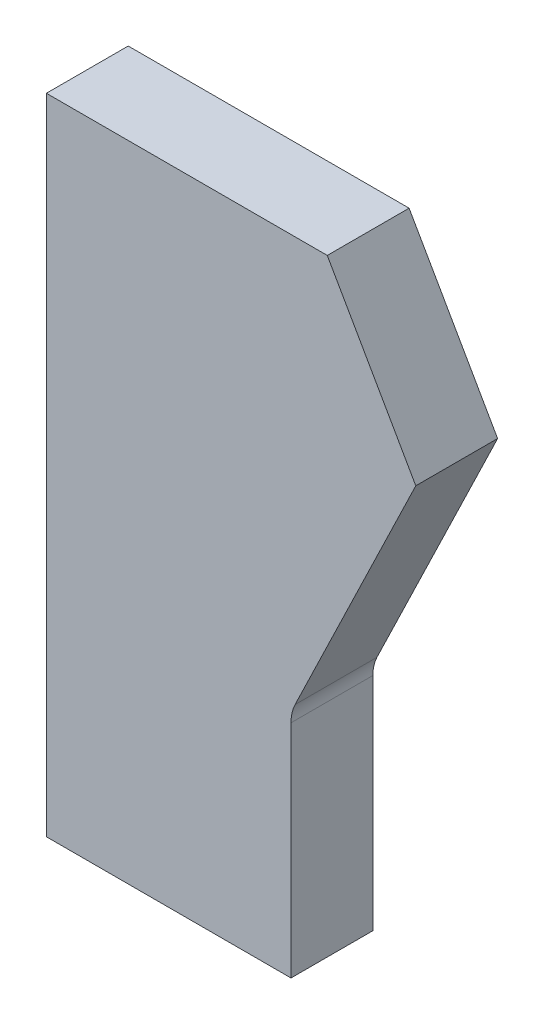
ISO-10303-21;
HEADER;
FILE_DESCRIPTION(('STEP AP214'),'2;1');
FILE_NAME('part.step','',(''),(''),'','','');
FILE_SCHEMA(('AUTOMOTIVE_DESIGN { 1 0 10303 214 1 1 1 1 }'));
ENDSEC;
DATA;
#1=APPLICATION_CONTEXT('core data for automotive mechanical design processes');
#2=APPLICATION_PROTOCOL_DEFINITION('international standard','automotive_design',2000,#1);
#3=PRODUCT_CONTEXT('',#1,'mechanical');
#4=PRODUCT('Part','Part','',(#3));
#5=PRODUCT_RELATED_PRODUCT_CATEGORY('part','',(#4));
#6=PRODUCT_DEFINITION_FORMATION('','',#4);
#7=PRODUCT_DEFINITION_CONTEXT('part definition',#1,'design');
#8=PRODUCT_DEFINITION('design','',#6,#7);
#9=PRODUCT_DEFINITION_SHAPE('','',#8);
#10=(LENGTH_UNIT() NAMED_UNIT(*) SI_UNIT(.MILLI.,.METRE.));
#11=(NAMED_UNIT(*) PLANE_ANGLE_UNIT() SI_UNIT($,.RADIAN.));
#12=(NAMED_UNIT(*) SI_UNIT($,.STERADIAN.) SOLID_ANGLE_UNIT());
#13=UNCERTAINTY_MEASURE_WITH_UNIT(LENGTH_MEASURE(1.E-05),#10,'distance_accuracy_value','');
#14=(GEOMETRIC_REPRESENTATION_CONTEXT(3) GLOBAL_UNCERTAINTY_ASSIGNED_CONTEXT((#13)) GLOBAL_UNIT_ASSIGNED_CONTEXT((#10,
#11,#12)) REPRESENTATION_CONTEXT('',''));
#15=CARTESIAN_POINT('',(0.,0.,0.));
#16=DIRECTION('',(0.,0.,1.));
#17=DIRECTION('',(1.,0.,0.));
#18=AXIS2_PLACEMENT_3D('',#15,#16,#17);
#19=CARTESIAN_POINT('',(0.,199.877455637007,-25.4));
#20=DIRECTION('',(-1.,0.,0.));
#21=DIRECTION('',(0.,0.,1.));
#22=AXIS2_PLACEMENT_3D('',#19,#20,#21);
#23=PLANE('',#22);
#24=DIRECTION('',(0.,-1.,0.));
#25=VECTOR('',#24,1.);
#26=CARTESIAN_POINT('',(0.,199.877455637007,0.));
#27=LINE('',#26,#25);
#28=CARTESIAN_POINT('',(0.,199.877455637007,0.));
#29=VERTEX_POINT('',#28);
#30=CARTESIAN_POINT('',(0.,0.,0.));
#31=VERTEX_POINT('',#30);
#32=EDGE_CURVE('E122',#29,#31,#27,.T.);
#33=ORIENTED_EDGE('',*,*,#32,.F.);
#34=DIRECTION('',(0.,0.,1.));
#35=VECTOR('',#34,1.);
#36=CARTESIAN_POINT('',(0.,199.877455637007,-25.4));
#37=LINE('',#36,#35);
#38=CARTESIAN_POINT('',(0.,199.877455637007,-25.4));
#39=VERTEX_POINT('',#38);
#40=EDGE_CURVE('E11',#39,#29,#37,.T.);
#41=ORIENTED_EDGE('',*,*,#40,.F.);
#42=DIRECTION('',(0.,-1.,0.));
#43=VECTOR('',#42,1.);
#44=CARTESIAN_POINT('',(0.,199.877455637007,-25.4));
#45=LINE('',#44,#43);
#46=CARTESIAN_POINT('',(0.,0.,-25.4));
#47=VERTEX_POINT('',#46);
#48=EDGE_CURVE('E139',#39,#47,#45,.T.);
#49=ORIENTED_EDGE('',*,*,#48,.T.);
#50=DIRECTION('',(0.,0.,1.));
#51=VECTOR('',#50,1.);
#52=CARTESIAN_POINT('',(0.,0.,-25.4));
#53=LINE('',#52,#51);
#54=EDGE_CURVE('E34',#47,#31,#53,.T.);
#55=ORIENTED_EDGE('',*,*,#54,.T.);
#56=EDGE_LOOP('',(#33,#41,#49,#55));
#57=FACE_BOUND('',#56,.T.);
#58=ADVANCED_FACE('F31',(#57),#23,.T.);
#59=CARTESIAN_POINT('',(87.1895842060916,199.877455637007,-25.4));
#60=DIRECTION('',(0.,1.,0.));
#61=DIRECTION('',(0.,0.,1.));
#62=AXIS2_PLACEMENT_3D('',#59,#60,#61);
#63=PLANE('',#62);
#64=DIRECTION('',(-1.,0.,0.));
#65=VECTOR('',#64,1.);
#66=CARTESIAN_POINT('',(87.1895842060916,199.877455637007,0.));
#67=LINE('',#66,#65);
#68=CARTESIAN_POINT('',(87.1895842060916,199.877455637007,0.));
#69=VERTEX_POINT('',#68);
#70=EDGE_CURVE('E137',#69,#29,#67,.T.);
#71=ORIENTED_EDGE('',*,*,#70,.F.);
#72=DIRECTION('',(0.,0.,1.));
#73=VECTOR('',#72,1.);
#74=CARTESIAN_POINT('',(87.1895842060916,199.877455637007,-25.4));
#75=LINE('',#74,#73);
#76=CARTESIAN_POINT('',(87.1895842060916,199.877455637007,-25.4));
#77=VERTEX_POINT('',#76);
#78=EDGE_CURVE('E40',#77,#69,#75,.T.);
#79=ORIENTED_EDGE('',*,*,#78,.F.);
#80=DIRECTION('',(-1.,0.,0.));
#81=VECTOR('',#80,1.);
#82=CARTESIAN_POINT('',(87.1895842060916,199.877455637007,-25.4));
#83=LINE('',#82,#81);
#84=EDGE_CURVE('E112',#77,#39,#83,.T.);
#85=ORIENTED_EDGE('',*,*,#84,.T.);
#86=ORIENTED_EDGE('',*,*,#40,.T.);
#87=EDGE_LOOP('',(#71,#79,#85,#86));
#88=FACE_BOUND('',#87,.T.);
#89=ADVANCED_FACE('F149',(#88),#63,.T.);
#90=CARTESIAN_POINT('',(114.663486185974,151.685529213279,-25.4));
#91=DIRECTION('',(0.86874233800086,0.495264323533201,0.));
#92=DIRECTION('',(-0.495264323533201,0.86874233800086,0.));
#93=AXIS2_PLACEMENT_3D('',#90,#91,#92);
#94=PLANE('',#93);
#95=DIRECTION('',(-0.495264323533201,0.86874233800086,0.));
#96=VECTOR('',#95,1.);
#97=CARTESIAN_POINT('',(114.663486185974,151.685529213279,0.));
#98=LINE('',#97,#96);
#99=CARTESIAN_POINT('',(114.663486185974,151.685529213279,0.));
#100=VERTEX_POINT('',#99);
#101=EDGE_CURVE('E99',#100,#69,#98,.T.);
#102=ORIENTED_EDGE('',*,*,#101,.F.);
#103=DIRECTION('',(0.,0.,1.));
#104=VECTOR('',#103,1.);
#105=CARTESIAN_POINT('',(114.663486185974,151.685529213279,-25.4));
#106=LINE('',#105,#104);
#107=CARTESIAN_POINT('',(114.663486185974,151.685529213279,-25.4));
#108=VERTEX_POINT('',#107);
#109=EDGE_CURVE('E94',#108,#100,#106,.T.);
#110=ORIENTED_EDGE('',*,*,#109,.F.);
#111=DIRECTION('',(-0.495264323533201,0.86874233800086,0.));
#112=VECTOR('',#111,1.);
#113=CARTESIAN_POINT('',(114.663486185974,151.685529213279,-25.4));
#114=LINE('',#113,#112);
#115=EDGE_CURVE('E97',#108,#77,#114,.T.);
#116=ORIENTED_EDGE('',*,*,#115,.T.);
#117=ORIENTED_EDGE('',*,*,#78,.T.);
#118=EDGE_LOOP('',(#102,#110,#116,#117));
#119=FACE_BOUND('',#118,.T.);
#120=ADVANCED_FACE('F96',(#119),#94,.T.);
#121=CARTESIAN_POINT('',(77.1945177207634,74.1334782038901,-25.4));
#122=DIRECTION('',(0.900415007238886,-0.435031969789574,0.));
#123=DIRECTION('',(0.435031969789575,0.900415007238886,0.));
#124=AXIS2_PLACEMENT_3D('',#121,#122,#123);
#125=PLANE('',#124);
#126=DIRECTION('',(0.435031969789574,0.900415007238886,0.));
#127=VECTOR('',#126,1.);
#128=CARTESIAN_POINT('',(77.1945177207634,74.1334782038901,0.));
#129=LINE('',#128,#127);
#130=CARTESIAN_POINT('',(77.1945177207634,74.1334782038901,0.));
#131=VERTEX_POINT('',#130);
#132=EDGE_CURVE('E134',#131,#100,#129,.T.);
#133=ORIENTED_EDGE('',*,*,#132,.F.);
#134=DIRECTION('',(0.,0.,1.));
#135=VECTOR('',#134,1.);
#136=CARTESIAN_POINT('',(77.1945177207634,74.1334782038901,-25.4));
#137=LINE('',#136,#135);
#138=CARTESIAN_POINT('',(77.1945177207634,74.1334782038901,-25.4));
#139=VERTEX_POINT('',#138);
#140=EDGE_CURVE('E104',#139,#131,#137,.T.);
#141=ORIENTED_EDGE('',*,*,#140,.F.);
#142=DIRECTION('',(0.435031969789574,0.900415007238886,0.));
#143=VECTOR('',#142,1.);
#144=CARTESIAN_POINT('',(77.1945177207634,74.1334782038901,-25.4));
#145=LINE('',#144,#143);
#146=EDGE_CURVE('E110',#139,#108,#145,.T.);
#147=ORIENTED_EDGE('',*,*,#146,.T.);
#148=ORIENTED_EDGE('',*,*,#109,.T.);
#149=EDGE_LOOP('',(#133,#141,#147,#148));
#150=FACE_BOUND('',#149,.T.);
#151=ADVANCED_FACE('F114',(#150),#125,.T.);
#152=CARTESIAN_POINT('',(88.6297883126972,68.6085721875625,-25.4));
#153=DIRECTION('',(0.,0.,1.));
#154=DIRECTION('',(1.,0.,0.));
#155=AXIS2_PLACEMENT_3D('',#152,#153,#154);
#156=CYLINDRICAL_SURFACE('',#155,12.7);
#157=CARTESIAN_POINT('',(88.6297883126972,68.6085721875625,0.));
#158=DIRECTION('',(0.,0.,-1.));
#159=DIRECTION('',(-1.,0.,0.));
#160=AXIS2_PLACEMENT_3D('',#157,#158,#159);
#161=CIRCLE('',#160,12.7);
#162=CARTESIAN_POINT('',(75.9297883126972,68.6085721875624,0.));
#163=VERTEX_POINT('',#162);
#164=EDGE_CURVE('E131',#163,#131,#161,.T.);
#165=ORIENTED_EDGE('',*,*,#164,.F.);
#166=DIRECTION('',(0.,0.,1.));
#167=VECTOR('',#166,1.);
#168=CARTESIAN_POINT('',(75.9297883126972,68.6085721875624,-25.4));
#169=LINE('',#168,#167);
#170=CARTESIAN_POINT('',(75.9297883126972,68.6085721875624,-25.4));
#171=VERTEX_POINT('',#170);
#172=EDGE_CURVE('E143',#171,#163,#169,.T.);
#173=ORIENTED_EDGE('',*,*,#172,.F.);
#174=CARTESIAN_POINT('',(88.6297883126972,68.6085721875625,-25.4));
#175=DIRECTION('',(0.,0.,-1.));
#176=DIRECTION('',(-1.,0.,0.));
#177=AXIS2_PLACEMENT_3D('',#174,#175,#176);
#178=CIRCLE('',#177,12.7);
#179=EDGE_CURVE('E115',#171,#139,#178,.T.);
#180=ORIENTED_EDGE('',*,*,#179,.T.);
#181=ORIENTED_EDGE('',*,*,#140,.T.);
#182=EDGE_LOOP('',(#165,#173,#180,#181));
#183=FACE_BOUND('',#182,.T.);
#184=ADVANCED_FACE('F162',(#183),#156,.F.);
#185=CARTESIAN_POINT('',(75.9297883126972,0.,-25.4));
#186=DIRECTION('',(1.,0.,0.));
#187=DIRECTION('',(0.,0.,-1.));
#188=AXIS2_PLACEMENT_3D('',#185,#186,#187);
#189=PLANE('',#188);
#190=DIRECTION('',(0.,1.,0.));
#191=VECTOR('',#190,1.);
#192=CARTESIAN_POINT('',(75.9297883126972,0.,0.));
#193=LINE('',#192,#191);
#194=CARTESIAN_POINT('',(75.9297883126972,0.,0.));
#195=VERTEX_POINT('',#194);
#196=EDGE_CURVE('E128',#195,#163,#193,.T.);
#197=ORIENTED_EDGE('',*,*,#196,.F.);
#198=DIRECTION('',(0.,0.,1.));
#199=VECTOR('',#198,1.);
#200=CARTESIAN_POINT('',(75.9297883126972,0.,-25.4));
#201=LINE('',#200,#199);
#202=CARTESIAN_POINT('',(75.9297883126972,0.,-25.4));
#203=VERTEX_POINT('',#202);
#204=EDGE_CURVE('E144',#203,#195,#201,.T.);
#205=ORIENTED_EDGE('',*,*,#204,.F.);
#206=DIRECTION('',(0.,1.,0.));
#207=VECTOR('',#206,1.);
#208=CARTESIAN_POINT('',(75.9297883126972,0.,-25.4));
#209=LINE('',#208,#207);
#210=EDGE_CURVE('E117',#203,#171,#209,.T.);
#211=ORIENTED_EDGE('',*,*,#210,.T.);
#212=ORIENTED_EDGE('',*,*,#172,.T.);
#213=EDGE_LOOP('',(#197,#205,#211,#212));
#214=FACE_BOUND('',#213,.T.);
#215=ADVANCED_FACE('F165',(#214),#189,.T.);
#216=CARTESIAN_POINT('',(0.,0.,-25.4));
#217=DIRECTION('',(0.,-1.,0.));
#218=DIRECTION('',(0.,0.,-1.));
#219=AXIS2_PLACEMENT_3D('',#216,#217,#218);
#220=PLANE('',#219);
#221=DIRECTION('',(1.,0.,0.));
#222=VECTOR('',#221,1.);
#223=CARTESIAN_POINT('',(0.,0.,0.));
#224=LINE('',#223,#222);
#225=EDGE_CURVE('E125',#31,#195,#224,.T.);
#226=ORIENTED_EDGE('',*,*,#225,.F.);
#227=ORIENTED_EDGE('',*,*,#54,.F.);
#228=DIRECTION('',(1.,0.,0.));
#229=VECTOR('',#228,1.);
#230=CARTESIAN_POINT('',(0.,0.,-25.4));
#231=LINE('',#230,#229);
#232=EDGE_CURVE('E227',#47,#203,#231,.T.);
#233=ORIENTED_EDGE('',*,*,#232,.T.);
#234=ORIENTED_EDGE('',*,*,#204,.T.);
#235=EDGE_LOOP('',(#226,#227,#233,#234));
#236=FACE_BOUND('',#235,.T.);
#237=ADVANCED_FACE('F146',(#236),#220,.T.);
#238=CARTESIAN_POINT('',(88.6297883126972,68.6085721875625,-25.4));
#239=DIRECTION('',(0.,0.,-1.));
#240=DIRECTION('',(-1.,0.,0.));
#241=AXIS2_PLACEMENT_3D('',#238,#239,#240);
#242=PLANE('',#241);
#243=ORIENTED_EDGE('',*,*,#48,.F.);
#244=ORIENTED_EDGE('',*,*,#84,.F.);
#245=ORIENTED_EDGE('',*,*,#115,.F.);
#246=ORIENTED_EDGE('',*,*,#146,.F.);
#247=ORIENTED_EDGE('',*,*,#179,.F.);
#248=ORIENTED_EDGE('',*,*,#210,.F.);
#249=ORIENTED_EDGE('',*,*,#232,.F.);
#250=EDGE_LOOP('',(#243,#244,#245,#246,#247,#248,#249));
#251=FACE_BOUND('',#250,.T.);
#252=ADVANCED_FACE('F108',(#251),#242,.T.);
#253=CARTESIAN_POINT('',(88.6297883126972,68.6085721875625,0.));
#254=DIRECTION('',(0.,0.,-1.));
#255=DIRECTION('',(-1.,0.,0.));
#256=AXIS2_PLACEMENT_3D('',#253,#254,#255);
#257=PLANE('',#256);
#258=ORIENTED_EDGE('',*,*,#32,.T.);
#259=ORIENTED_EDGE('',*,*,#225,.T.);
#260=ORIENTED_EDGE('',*,*,#196,.T.);
#261=ORIENTED_EDGE('',*,*,#164,.T.);
#262=ORIENTED_EDGE('',*,*,#132,.T.);
#263=ORIENTED_EDGE('',*,*,#101,.T.);
#264=ORIENTED_EDGE('',*,*,#70,.T.);
#265=EDGE_LOOP('',(#258,#259,#260,#261,#262,#263,#264));
#266=FACE_BOUND('',#265,.T.);
#267=ADVANCED_FACE('F148',(#266),#257,.F.);
#268=CLOSED_SHELL('',(#58,#89,#120,#151,#184,#215,#237,#252,#267));
#269=MANIFOLD_SOLID_BREP('B2',#268);
#270=ADVANCED_BREP_SHAPE_REPRESENTATION('',(#18,#269),#14);
#271=SHAPE_DEFINITION_REPRESENTATION(#9,#270);
ENDSEC;
END-ISO-10303-21;
